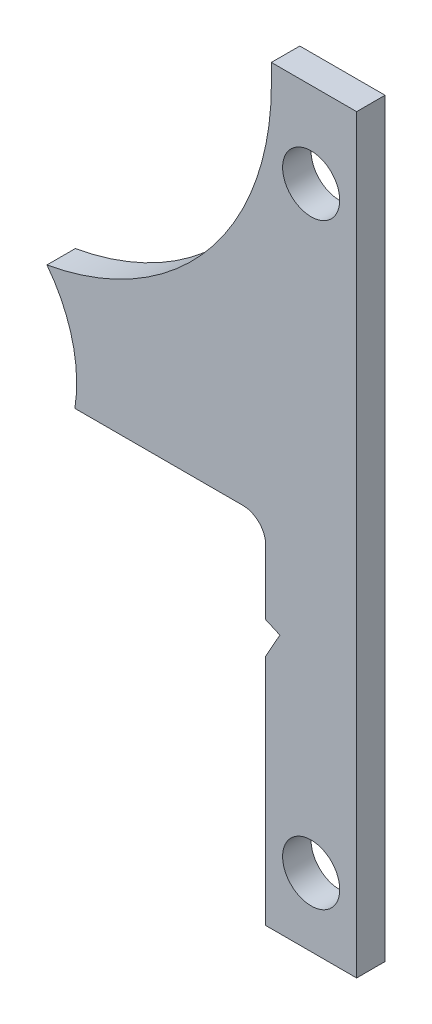
ISO-10303-21;
HEADER;
FILE_DESCRIPTION(('STEP AP214'),'2;1');
FILE_NAME('part.step','',(''),(''),'','','');
FILE_SCHEMA(('AUTOMOTIVE_DESIGN { 1 0 10303 214 1 1 1 1 }'));
ENDSEC;
DATA;
#1=APPLICATION_CONTEXT('core data for automotive mechanical design processes');
#2=APPLICATION_PROTOCOL_DEFINITION('international standard','automotive_design',2000,#1);
#3=PRODUCT_CONTEXT('',#1,'mechanical');
#4=PRODUCT('Part','Part','',(#3));
#5=PRODUCT_RELATED_PRODUCT_CATEGORY('part','',(#4));
#6=PRODUCT_DEFINITION_FORMATION('','',#4);
#7=PRODUCT_DEFINITION_CONTEXT('part definition',#1,'design');
#8=PRODUCT_DEFINITION('design','',#6,#7);
#9=PRODUCT_DEFINITION_SHAPE('','',#8);
#10=(LENGTH_UNIT() NAMED_UNIT(*) SI_UNIT(.MILLI.,.METRE.));
#11=(NAMED_UNIT(*) PLANE_ANGLE_UNIT() SI_UNIT($,.RADIAN.));
#12=(NAMED_UNIT(*) SI_UNIT($,.STERADIAN.) SOLID_ANGLE_UNIT());
#13=UNCERTAINTY_MEASURE_WITH_UNIT(LENGTH_MEASURE(1.E-05),#10,'distance_accuracy_value','');
#14=(GEOMETRIC_REPRESENTATION_CONTEXT(3) GLOBAL_UNCERTAINTY_ASSIGNED_CONTEXT((#13)) GLOBAL_UNIT_ASSIGNED_CONTEXT((#10,
#11,#12)) REPRESENTATION_CONTEXT('',''));
#15=CARTESIAN_POINT('',(0.,0.,0.));
#16=DIRECTION('',(0.,0.,1.));
#17=DIRECTION('',(1.,0.,0.));
#18=AXIS2_PLACEMENT_3D('',#15,#16,#17);
#19=CARTESIAN_POINT('',(0.,66.,2.5));
#20=DIRECTION('',(-1.,0.,0.));
#21=DIRECTION('',(0.,-1.,0.));
#22=AXIS2_PLACEMENT_3D('',#19,#20,#21);
#23=PLANE('',#22);
#24=DIRECTION('',(0.,1.,0.));
#25=VECTOR('',#24,1.);
#26=CARTESIAN_POINT('',(0.,66.,-2.5));
#27=LINE('',#26,#25);
#28=CARTESIAN_POINT('',(0.,-66.,-2.5));
#29=VERTEX_POINT('',#28);
#30=CARTESIAN_POINT('',(0.,66.,-2.5));
#31=VERTEX_POINT('',#30);
#32=EDGE_CURVE('E153',#29,#31,#27,.T.);
#33=ORIENTED_EDGE('',*,*,#32,.T.);
#34=DIRECTION('',(0.,0.,-1.));
#35=VECTOR('',#34,1.);
#36=CARTESIAN_POINT('',(0.,66.,2.5));
#37=LINE('',#36,#35);
#38=CARTESIAN_POINT('',(0.,66.,2.5));
#39=VERTEX_POINT('',#38);
#40=EDGE_CURVE('E11',#39,#31,#37,.T.);
#41=ORIENTED_EDGE('',*,*,#40,.F.);
#42=DIRECTION('',(0.,1.,0.));
#43=VECTOR('',#42,1.);
#44=CARTESIAN_POINT('',(0.,66.,2.5));
#45=LINE('',#44,#43);
#46=CARTESIAN_POINT('',(0.,-66.,2.5));
#47=VERTEX_POINT('',#46);
#48=EDGE_CURVE('E176',#47,#39,#45,.T.);
#49=ORIENTED_EDGE('',*,*,#48,.F.);
#50=DIRECTION('',(0.,0.,-1.));
#51=VECTOR('',#50,1.);
#52=CARTESIAN_POINT('',(0.,-66.,2.5));
#53=LINE('',#52,#51);
#54=EDGE_CURVE('E149',#47,#29,#53,.T.);
#55=ORIENTED_EDGE('',*,*,#54,.T.);
#56=EDGE_LOOP('',(#33,#41,#49,#55));
#57=FACE_BOUND('',#56,.T.);
#58=ADVANCED_FACE('F33',(#57),#23,.F.);
#59=CARTESIAN_POINT('',(0.,66.,2.5));
#60=DIRECTION('',(0.,-1.,0.));
#61=DIRECTION('',(1.,0.,0.));
#62=AXIS2_PLACEMENT_3D('',#59,#60,#61);
#63=PLANE('',#62);
#64=DIRECTION('',(-1.,0.,0.));
#65=VECTOR('',#64,1.);
#66=CARTESIAN_POINT('',(0.,66.,-2.5));
#67=LINE('',#66,#65);
#68=CARTESIAN_POINT('',(-15.,66.,-2.5));
#69=VERTEX_POINT('',#68);
#70=EDGE_CURVE('E156',#31,#69,#67,.T.);
#71=ORIENTED_EDGE('',*,*,#70,.T.);
#72=DIRECTION('',(0.,0.,-1.));
#73=VECTOR('',#72,1.);
#74=CARTESIAN_POINT('',(-15.,66.,2.5));
#75=LINE('',#74,#73);
#76=CARTESIAN_POINT('',(-15.,66.,2.5));
#77=VERTEX_POINT('',#76);
#78=EDGE_CURVE('E41',#77,#69,#75,.T.);
#79=ORIENTED_EDGE('',*,*,#78,.F.);
#80=DIRECTION('',(-1.,0.,0.));
#81=VECTOR('',#80,1.);
#82=CARTESIAN_POINT('',(0.,66.,2.5));
#83=LINE('',#82,#81);
#84=EDGE_CURVE('E104',#39,#77,#83,.T.);
#85=ORIENTED_EDGE('',*,*,#84,.F.);
#86=ORIENTED_EDGE('',*,*,#40,.T.);
#87=EDGE_LOOP('',(#71,#79,#85,#86));
#88=FACE_BOUND('',#87,.T.);
#89=ADVANCED_FACE('F255',(#88),#63,.F.);
#90=CARTESIAN_POINT('',(-15.,66.,2.5));
#91=DIRECTION('',(1.,0.,0.));
#92=DIRECTION('',(0.,0.,-1.));
#93=AXIS2_PLACEMENT_3D('',#90,#91,#92);
#94=PLANE('',#93);
#95=DIRECTION('',(0.,-1.,0.));
#96=VECTOR('',#95,1.);
#97=CARTESIAN_POINT('',(-15.,66.,-2.5));
#98=LINE('',#97,#96);
#99=CARTESIAN_POINT('',(-15.,62.56,-2.5));
#100=VERTEX_POINT('',#99);
#101=EDGE_CURVE('E159',#69,#100,#98,.T.);
#102=ORIENTED_EDGE('',*,*,#101,.T.);
#103=DIRECTION('',(0.,0.,-1.));
#104=VECTOR('',#103,1.);
#105=CARTESIAN_POINT('',(-15.,62.56,2.5));
#106=LINE('',#105,#104);
#107=CARTESIAN_POINT('',(-15.,62.56,2.5));
#108=VERTEX_POINT('',#107);
#109=EDGE_CURVE('E195',#108,#100,#106,.T.);
#110=ORIENTED_EDGE('',*,*,#109,.F.);
#111=DIRECTION('',(0.,-1.,0.));
#112=VECTOR('',#111,1.);
#113=CARTESIAN_POINT('',(-15.,66.,2.5));
#114=LINE('',#113,#112);
#115=EDGE_CURVE('E203',#77,#108,#114,.T.);
#116=ORIENTED_EDGE('',*,*,#115,.F.);
#117=ORIENTED_EDGE('',*,*,#78,.T.);
#118=EDGE_LOOP('',(#102,#110,#116,#117));
#119=FACE_BOUND('',#118,.T.);
#120=ADVANCED_FACE('F201',(#119),#94,.F.);
#121=CARTESIAN_POINT('',(-62.9,62.56,2.5));
#122=DIRECTION('',(0.,0.,-1.));
#123=DIRECTION('',(-1.,0.,0.));
#124=AXIS2_PLACEMENT_3D('',#121,#122,#123);
#125=CYLINDRICAL_SURFACE('',#124,47.9);
#126=CARTESIAN_POINT('',(-62.9,62.56,-2.5));
#127=DIRECTION('',(0.,0.,-1.));
#128=DIRECTION('',(1.,0.,0.));
#129=AXIS2_PLACEMENT_3D('',#126,#127,#128);
#130=CIRCLE('',#129,47.9);
#131=CARTESIAN_POINT('',(-54.4813380343508,15.4056138762455,-2.5));
#132=VERTEX_POINT('',#131);
#133=EDGE_CURVE('E161',#100,#132,#130,.T.);
#134=ORIENTED_EDGE('',*,*,#133,.T.);
#135=DIRECTION('',(0.,0.,-1.));
#136=VECTOR('',#135,1.);
#137=CARTESIAN_POINT('',(-54.4813380343508,15.4056138762455,2.5));
#138=LINE('',#137,#136);
#139=CARTESIAN_POINT('',(-54.4813380343508,15.4056138762455,2.5));
#140=VERTEX_POINT('',#139);
#141=EDGE_CURVE('E192',#140,#132,#138,.T.);
#142=ORIENTED_EDGE('',*,*,#141,.F.);
#143=CARTESIAN_POINT('',(-62.9,62.56,2.5));
#144=DIRECTION('',(0.,0.,-1.));
#145=DIRECTION('',(1.,0.,0.));
#146=AXIS2_PLACEMENT_3D('',#143,#144,#145);
#147=CIRCLE('',#146,47.9);
#148=EDGE_CURVE('E221',#108,#140,#147,.T.);
#149=ORIENTED_EDGE('',*,*,#148,.F.);
#150=ORIENTED_EDGE('',*,*,#109,.T.);
#151=EDGE_LOOP('',(#134,#142,#149,#150));
#152=FACE_BOUND('',#151,.T.);
#153=ADVANCED_FACE('F212',(#152),#125,.F.);
#154=CARTESIAN_POINT('',(-74.52,0.0100000000000009,2.5));
#155=DIRECTION('',(0.,0.,-1.));
#156=DIRECTION('',(-1.,0.,0.));
#157=AXIS2_PLACEMENT_3D('',#154,#155,#156);
#158=CYLINDRICAL_SURFACE('',#157,25.27);
#159=CARTESIAN_POINT('',(-74.52,0.0100000000000009,-2.5));
#160=DIRECTION('',(0.,0.,-1.));
#161=DIRECTION('',(1.,0.,0.));
#162=AXIS2_PLACEMENT_3D('',#159,#160,#161);
#163=CIRCLE('',#162,25.27);
#164=CARTESIAN_POINT('',(-49.5701943895348,-3.99999999999999,-2.5));
#165=VERTEX_POINT('',#164);
#166=EDGE_CURVE('E163',#132,#165,#163,.T.);
#167=ORIENTED_EDGE('',*,*,#166,.T.);
#168=DIRECTION('',(0.,0.,-1.));
#169=VECTOR('',#168,1.);
#170=CARTESIAN_POINT('',(-49.5701943895348,-3.99999999999999,2.5));
#171=LINE('',#170,#169);
#172=CARTESIAN_POINT('',(-49.5701943895348,-3.99999999999999,2.5));
#173=VERTEX_POINT('',#172);
#174=EDGE_CURVE('E189',#173,#165,#171,.T.);
#175=ORIENTED_EDGE('',*,*,#174,.F.);
#176=CARTESIAN_POINT('',(-74.52,0.0100000000000009,2.5));
#177=DIRECTION('',(0.,0.,-1.));
#178=DIRECTION('',(1.,0.,0.));
#179=AXIS2_PLACEMENT_3D('',#176,#177,#178);
#180=CIRCLE('',#179,25.27);
#181=EDGE_CURVE('E218',#140,#173,#180,.T.);
#182=ORIENTED_EDGE('',*,*,#181,.F.);
#183=ORIENTED_EDGE('',*,*,#141,.T.);
#184=EDGE_LOOP('',(#167,#175,#182,#183));
#185=FACE_BOUND('',#184,.T.);
#186=ADVANCED_FACE('F216',(#185),#158,.F.);
#187=CARTESIAN_POINT('',(-49.5701943895348,-4.,2.5));
#188=DIRECTION('',(0.,1.,0.));
#189=DIRECTION('',(-1.,0.,0.));
#190=AXIS2_PLACEMENT_3D('',#187,#188,#189);
#191=PLANE('',#190);
#192=DIRECTION('',(1.,0.,0.));
#193=VECTOR('',#192,1.);
#194=CARTESIAN_POINT('',(-49.5701943895348,-4.,-2.5));
#195=LINE('',#194,#193);
#196=CARTESIAN_POINT('',(-20.,-3.99999999999999,-2.5));
#197=VERTEX_POINT('',#196);
#198=EDGE_CURVE('E165',#165,#197,#195,.T.);
#199=ORIENTED_EDGE('',*,*,#198,.T.);
#200=DIRECTION('',(0.,0.,-1.));
#201=VECTOR('',#200,1.);
#202=CARTESIAN_POINT('',(-20.,-3.99999999999999,2.5));
#203=LINE('',#202,#201);
#204=CARTESIAN_POINT('',(-20.,-3.99999999999999,2.5));
#205=VERTEX_POINT('',#204);
#206=EDGE_CURVE('E186',#205,#197,#203,.T.);
#207=ORIENTED_EDGE('',*,*,#206,.F.);
#208=DIRECTION('',(1.,0.,0.));
#209=VECTOR('',#208,1.);
#210=CARTESIAN_POINT('',(-49.5701943895348,-4.,2.5));
#211=LINE('',#210,#209);
#212=EDGE_CURVE('E220',#173,#205,#211,.T.);
#213=ORIENTED_EDGE('',*,*,#212,.F.);
#214=ORIENTED_EDGE('',*,*,#174,.T.);
#215=EDGE_LOOP('',(#199,#207,#213,#214));
#216=FACE_BOUND('',#215,.T.);
#217=ADVANCED_FACE('F268',(#216),#191,.F.);
#218=CARTESIAN_POINT('',(-20.,-8.,2.5));
#219=DIRECTION('',(0.,0.,-1.));
#220=DIRECTION('',(-1.,0.,0.));
#221=AXIS2_PLACEMENT_3D('',#218,#219,#220);
#222=CYLINDRICAL_SURFACE('',#221,4.);
#223=CARTESIAN_POINT('',(-20.,-8.,-2.5));
#224=DIRECTION('',(0.,0.,-1.));
#225=DIRECTION('',(1.,0.,0.));
#226=AXIS2_PLACEMENT_3D('',#223,#224,#225);
#227=CIRCLE('',#226,4.);
#228=CARTESIAN_POINT('',(-16.,-7.99999999999999,-2.5));
#229=VERTEX_POINT('',#228);
#230=EDGE_CURVE('E167',#197,#229,#227,.T.);
#231=ORIENTED_EDGE('',*,*,#230,.T.);
#232=DIRECTION('',(0.,0.,-1.));
#233=VECTOR('',#232,1.);
#234=CARTESIAN_POINT('',(-16.,-7.99999999999999,2.5));
#235=LINE('',#234,#233);
#236=CARTESIAN_POINT('',(-16.,-7.99999999999999,2.5));
#237=VERTEX_POINT('',#236);
#238=EDGE_CURVE('E183',#237,#229,#235,.T.);
#239=ORIENTED_EDGE('',*,*,#238,.F.);
#240=CARTESIAN_POINT('',(-20.,-8.,2.5));
#241=DIRECTION('',(0.,0.,-1.));
#242=DIRECTION('',(1.,0.,0.));
#243=AXIS2_PLACEMENT_3D('',#240,#241,#242);
#244=CIRCLE('',#243,4.);
#245=EDGE_CURVE('E223',#205,#237,#244,.T.);
#246=ORIENTED_EDGE('',*,*,#245,.F.);
#247=ORIENTED_EDGE('',*,*,#206,.T.);
#248=EDGE_LOOP('',(#231,#239,#246,#247));
#249=FACE_BOUND('',#248,.T.);
#250=ADVANCED_FACE('F271',(#249),#222,.F.);
#251=CARTESIAN_POINT('',(-16.,-19.4030915250128,2.5));
#252=DIRECTION('',(1.,0.,0.));
#253=DIRECTION('',(0.,1.,0.));
#254=AXIS2_PLACEMENT_3D('',#251,#252,#253);
#255=PLANE('',#254);
#256=DIRECTION('',(0.,-1.,0.));
#257=VECTOR('',#256,1.);
#258=CARTESIAN_POINT('',(-16.,-19.4030915250128,-2.5));
#259=LINE('',#258,#257);
#260=CARTESIAN_POINT('',(-16.,-19.4030915250128,-2.5));
#261=VERTEX_POINT('',#260);
#262=EDGE_CURVE('E169',#229,#261,#259,.T.);
#263=ORIENTED_EDGE('',*,*,#262,.T.);
#264=DIRECTION('',(0.,0.,-1.));
#265=VECTOR('',#264,1.);
#266=CARTESIAN_POINT('',(-16.,-19.4030915250128,2.5));
#267=LINE('',#266,#265);
#268=CARTESIAN_POINT('',(-16.,-19.4030915250128,2.5));
#269=VERTEX_POINT('',#268);
#270=EDGE_CURVE('E180',#269,#261,#267,.T.);
#271=ORIENTED_EDGE('',*,*,#270,.F.);
#272=DIRECTION('',(0.,-1.,0.));
#273=VECTOR('',#272,1.);
#274=CARTESIAN_POINT('',(-16.,-19.4030915250128,2.5));
#275=LINE('',#274,#273);
#276=EDGE_CURVE('E229',#237,#269,#275,.T.);
#277=ORIENTED_EDGE('',*,*,#276,.F.);
#278=ORIENTED_EDGE('',*,*,#238,.T.);
#279=EDGE_LOOP('',(#263,#271,#277,#278));
#280=FACE_BOUND('',#279,.T.);
#281=ADVANCED_FACE('F235',(#280),#255,.F.);
#282=CARTESIAN_POINT('',(-16.,-19.4030915250128,2.5));
#283=DIRECTION('',(0.402330683107616,0.915494413653169,0.));
#284=DIRECTION('',(-0.915494413653169,0.402330683107616,0.));
#285=AXIS2_PLACEMENT_3D('',#282,#283,#284);
#286=PLANE('',#285);
#287=DIRECTION('',(0.915494413653169,-0.402330683107616,0.));
#288=VECTOR('',#287,1.);
#289=CARTESIAN_POINT('',(-16.,-19.4030915250128,-2.5));
#290=LINE('',#289,#288);
#291=CARTESIAN_POINT('',(-13.5007002507268,-20.5014542898966,-2.5));
#292=VERTEX_POINT('',#291);
#293=EDGE_CURVE('E171',#261,#292,#290,.T.);
#294=ORIENTED_EDGE('',*,*,#293,.T.);
#295=DIRECTION('',(0.,0.,-1.));
#296=VECTOR('',#295,1.);
#297=CARTESIAN_POINT('',(-13.5007002507268,-20.5014542898966,2.5));
#298=LINE('',#297,#296);
#299=CARTESIAN_POINT('',(-13.5007002507268,-20.5014542898966,2.5));
#300=VERTEX_POINT('',#299);
#301=EDGE_CURVE('E144',#300,#292,#298,.T.);
#302=ORIENTED_EDGE('',*,*,#301,.F.);
#303=DIRECTION('',(0.915494413653169,-0.402330683107616,0.));
#304=VECTOR('',#303,1.);
#305=CARTESIAN_POINT('',(-16.,-19.4030915250128,2.5));
#306=LINE('',#305,#304);
#307=EDGE_CURVE('E135',#269,#300,#306,.T.);
#308=ORIENTED_EDGE('',*,*,#307,.F.);
#309=ORIENTED_EDGE('',*,*,#270,.T.);
#310=EDGE_LOOP('',(#294,#302,#308,#309));
#311=FACE_BOUND('',#310,.T.);
#312=ADVANCED_FACE('F239',(#311),#286,.F.);
#313=CARTESIAN_POINT('',(-13.5007002507268,-20.5014542898966,2.5));
#314=DIRECTION('',(0.872762834004564,-0.488144482279911,0.));
#315=DIRECTION('',(0.488144482279911,0.872762834004564,0.));
#316=AXIS2_PLACEMENT_3D('',#313,#314,#315);
#317=PLANE('',#316);
#318=DIRECTION('',(-0.488144482279911,-0.872762834004564,0.));
#319=VECTOR('',#318,1.);
#320=CARTESIAN_POINT('',(-13.5007002507268,-20.5014542898966,-2.5));
#321=LINE('',#320,#319);
#322=CARTESIAN_POINT('',(-16.,-24.97,-2.5));
#323=VERTEX_POINT('',#322);
#324=EDGE_CURVE('E143',#292,#323,#321,.T.);
#325=ORIENTED_EDGE('',*,*,#324,.T.);
#326=DIRECTION('',(0.,0.,-1.));
#327=VECTOR('',#326,1.);
#328=CARTESIAN_POINT('',(-16.,-24.97,2.5));
#329=LINE('',#328,#327);
#330=CARTESIAN_POINT('',(-16.,-24.97,2.5));
#331=VERTEX_POINT('',#330);
#332=EDGE_CURVE('E140',#331,#323,#329,.T.);
#333=ORIENTED_EDGE('',*,*,#332,.F.);
#334=DIRECTION('',(-0.488144482279911,-0.872762834004564,0.));
#335=VECTOR('',#334,1.);
#336=CARTESIAN_POINT('',(-13.5007002507268,-20.5014542898966,2.5));
#337=LINE('',#336,#335);
#338=EDGE_CURVE('E129',#300,#331,#337,.T.);
#339=ORIENTED_EDGE('',*,*,#338,.F.);
#340=ORIENTED_EDGE('',*,*,#301,.T.);
#341=EDGE_LOOP('',(#325,#333,#339,#340));
#342=FACE_BOUND('',#341,.T.);
#343=ADVANCED_FACE('F141',(#342),#317,.F.);
#344=CARTESIAN_POINT('',(-16.,-24.97,2.5));
#345=DIRECTION('',(1.,0.,0.));
#346=DIRECTION('',(0.,1.,0.));
#347=AXIS2_PLACEMENT_3D('',#344,#345,#346);
#348=PLANE('',#347);
#349=DIRECTION('',(0.,-1.,0.));
#350=VECTOR('',#349,1.);
#351=CARTESIAN_POINT('',(-16.,-24.97,-2.5));
#352=LINE('',#351,#350);
#353=CARTESIAN_POINT('',(-16.,-66.,-2.5));
#354=VERTEX_POINT('',#353);
#355=EDGE_CURVE('E90',#323,#354,#352,.T.);
#356=ORIENTED_EDGE('',*,*,#355,.T.);
#357=DIRECTION('',(0.,0.,-1.));
#358=VECTOR('',#357,1.);
#359=CARTESIAN_POINT('',(-16.,-66.,2.5));
#360=LINE('',#359,#358);
#361=CARTESIAN_POINT('',(-16.,-66.,2.5));
#362=VERTEX_POINT('',#361);
#363=EDGE_CURVE('E145',#362,#354,#360,.T.);
#364=ORIENTED_EDGE('',*,*,#363,.F.);
#365=DIRECTION('',(0.,-1.,0.));
#366=VECTOR('',#365,1.);
#367=CARTESIAN_POINT('',(-16.,-24.97,2.5));
#368=LINE('',#367,#366);
#369=EDGE_CURVE('E133',#331,#362,#368,.T.);
#370=ORIENTED_EDGE('',*,*,#369,.F.);
#371=ORIENTED_EDGE('',*,*,#332,.T.);
#372=EDGE_LOOP('',(#356,#364,#370,#371));
#373=FACE_BOUND('',#372,.T.);
#374=ADVANCED_FACE('F147',(#373),#348,.F.);
#375=CARTESIAN_POINT('',(0.,-66.,2.5));
#376=DIRECTION('',(0.,1.,0.));
#377=DIRECTION('',(0.,0.,1.));
#378=AXIS2_PLACEMENT_3D('',#375,#376,#377);
#379=PLANE('',#378);
#380=DIRECTION('',(1.,0.,0.));
#381=VECTOR('',#380,1.);
#382=CARTESIAN_POINT('',(0.,-66.,-2.5));
#383=LINE('',#382,#381);
#384=EDGE_CURVE('E96',#354,#29,#383,.T.);
#385=ORIENTED_EDGE('',*,*,#384,.T.);
#386=ORIENTED_EDGE('',*,*,#54,.F.);
#387=DIRECTION('',(1.,0.,0.));
#388=VECTOR('',#387,1.);
#389=CARTESIAN_POINT('',(0.,-66.,2.5));
#390=LINE('',#389,#388);
#391=EDGE_CURVE('E49',#362,#47,#390,.T.);
#392=ORIENTED_EDGE('',*,*,#391,.F.);
#393=ORIENTED_EDGE('',*,*,#363,.T.);
#394=EDGE_LOOP('',(#385,#386,#392,#393));
#395=FACE_BOUND('',#394,.T.);
#396=ADVANCED_FACE('F243',(#395),#379,.F.);
#397=CARTESIAN_POINT('',(-20.,-8.,2.5));
#398=DIRECTION('',(0.,0.,1.));
#399=DIRECTION('',(1.,0.,0.));
#400=AXIS2_PLACEMENT_3D('',#397,#398,#399);
#401=PLANE('',#400);
#402=CARTESIAN_POINT('',(-8.,51.,2.5));
#403=DIRECTION('',(0.,0.,1.));
#404=DIRECTION('',(1.,0.,0.));
#405=AXIS2_PLACEMENT_3D('',#402,#403,#404);
#406=CIRCLE('',#405,5.025);
#407=CARTESIAN_POINT('',(-2.975,51.,2.5));
#408=VERTEX_POINT('',#407);
#409=EDGE_CURVE('E336',#408,#408,#406,.T.);
#410=ORIENTED_EDGE('',*,*,#409,.F.);
#411=EDGE_LOOP('',(#410));
#412=FACE_BOUND('',#411,.T.);
#413=CARTESIAN_POINT('',(-8.,-54.,2.5));
#414=DIRECTION('',(0.,0.,1.));
#415=DIRECTION('',(1.,0.,0.));
#416=AXIS2_PLACEMENT_3D('',#413,#414,#415);
#417=CIRCLE('',#416,5.025);
#418=CARTESIAN_POINT('',(-2.975,-54.,2.5));
#419=VERTEX_POINT('',#418);
#420=EDGE_CURVE('E341',#419,#419,#417,.T.);
#421=ORIENTED_EDGE('',*,*,#420,.F.);
#422=EDGE_LOOP('',(#421));
#423=FACE_BOUND('',#422,.T.);
#424=ORIENTED_EDGE('',*,*,#48,.T.);
#425=ORIENTED_EDGE('',*,*,#84,.T.);
#426=ORIENTED_EDGE('',*,*,#115,.T.);
#427=ORIENTED_EDGE('',*,*,#148,.T.);
#428=ORIENTED_EDGE('',*,*,#181,.T.);
#429=ORIENTED_EDGE('',*,*,#212,.T.);
#430=ORIENTED_EDGE('',*,*,#245,.T.);
#431=ORIENTED_EDGE('',*,*,#276,.T.);
#432=ORIENTED_EDGE('',*,*,#307,.T.);
#433=ORIENTED_EDGE('',*,*,#338,.T.);
#434=ORIENTED_EDGE('',*,*,#369,.T.);
#435=ORIENTED_EDGE('',*,*,#391,.T.);
#436=EDGE_LOOP('',(#424,#425,#426,#427,#428,#429,#430,#431,#432,#433,#434,#435));
#437=FACE_BOUND('',#436,.T.);
#438=ADVANCED_FACE('F131',(#412,#423,#437),#401,.T.);
#439=CARTESIAN_POINT('',(-20.,-8.,-2.5));
#440=DIRECTION('',(0.,0.,1.));
#441=DIRECTION('',(1.,0.,0.));
#442=AXIS2_PLACEMENT_3D('',#439,#440,#441);
#443=PLANE('',#442);
#444=CARTESIAN_POINT('',(-8.,51.,-2.5));
#445=DIRECTION('',(0.,0.,1.));
#446=DIRECTION('',(1.,0.,0.));
#447=AXIS2_PLACEMENT_3D('',#444,#445,#446);
#448=CIRCLE('',#447,5.025);
#449=CARTESIAN_POINT('',(-2.975,51.,-2.5));
#450=VERTEX_POINT('',#449);
#451=EDGE_CURVE('E157',#450,#450,#448,.T.);
#452=ORIENTED_EDGE('',*,*,#451,.T.);
#453=EDGE_LOOP('',(#452));
#454=FACE_BOUND('',#453,.T.);
#455=CARTESIAN_POINT('',(-8.,-54.,-2.5));
#456=DIRECTION('',(0.,0.,1.));
#457=DIRECTION('',(1.,0.,0.));
#458=AXIS2_PLACEMENT_3D('',#455,#456,#457);
#459=CIRCLE('',#458,5.025);
#460=CARTESIAN_POINT('',(-2.975,-54.,-2.5));
#461=VERTEX_POINT('',#460);
#462=EDGE_CURVE('E337',#461,#461,#459,.T.);
#463=ORIENTED_EDGE('',*,*,#462,.T.);
#464=EDGE_LOOP('',(#463));
#465=FACE_BOUND('',#464,.T.);
#466=ORIENTED_EDGE('',*,*,#32,.F.);
#467=ORIENTED_EDGE('',*,*,#384,.F.);
#468=ORIENTED_EDGE('',*,*,#355,.F.);
#469=ORIENTED_EDGE('',*,*,#324,.F.);
#470=ORIENTED_EDGE('',*,*,#293,.F.);
#471=ORIENTED_EDGE('',*,*,#262,.F.);
#472=ORIENTED_EDGE('',*,*,#230,.F.);
#473=ORIENTED_EDGE('',*,*,#198,.F.);
#474=ORIENTED_EDGE('',*,*,#166,.F.);
#475=ORIENTED_EDGE('',*,*,#133,.F.);
#476=ORIENTED_EDGE('',*,*,#101,.F.);
#477=ORIENTED_EDGE('',*,*,#70,.F.);
#478=EDGE_LOOP('',(#466,#467,#468,#469,#470,#471,#472,#473,#474,#475,#476,#477));
#479=FACE_BOUND('',#478,.T.);
#480=ADVANCED_FACE('F207',(#454,#465,#479),#443,.F.);
#481=CARTESIAN_POINT('',(-8.,-54.,-2.5));
#482=DIRECTION('',(0.,0.,1.));
#483=DIRECTION('',(1.,0.,0.));
#484=AXIS2_PLACEMENT_3D('',#481,#482,#483);
#485=CYLINDRICAL_SURFACE('',#484,5.025);
#486=ORIENTED_EDGE('',*,*,#462,.F.);
#487=EDGE_LOOP('',(#486));
#488=FACE_BOUND('',#487,.T.);
#489=ORIENTED_EDGE('',*,*,#420,.T.);
#490=EDGE_LOOP('',(#489));
#491=FACE_BOUND('',#490,.T.);
#492=ADVANCED_FACE('F308',(#488,#491),#485,.F.);
#493=CARTESIAN_POINT('',(-8.,51.,-2.5));
#494=DIRECTION('',(0.,0.,1.));
#495=DIRECTION('',(1.,0.,0.));
#496=AXIS2_PLACEMENT_3D('',#493,#494,#495);
#497=CYLINDRICAL_SURFACE('',#496,5.025);
#498=ORIENTED_EDGE('',*,*,#451,.F.);
#499=EDGE_LOOP('',(#498));
#500=FACE_BOUND('',#499,.T.);
#501=ORIENTED_EDGE('',*,*,#409,.T.);
#502=EDGE_LOOP('',(#501));
#503=FACE_BOUND('',#502,.T.);
#504=ADVANCED_FACE('F317',(#500,#503),#497,.F.);
#505=CLOSED_SHELL('',(#58,#89,#120,#153,#186,#217,#250,#281,#312,#343,#374,#396,#438,#480,#492,#504));
#506=MANIFOLD_SOLID_BREP('B2',#505);
#507=ADVANCED_BREP_SHAPE_REPRESENTATION('',(#18,#506),#14);
#508=SHAPE_DEFINITION_REPRESENTATION(#9,#507);
ENDSEC;
END-ISO-10303-21;
